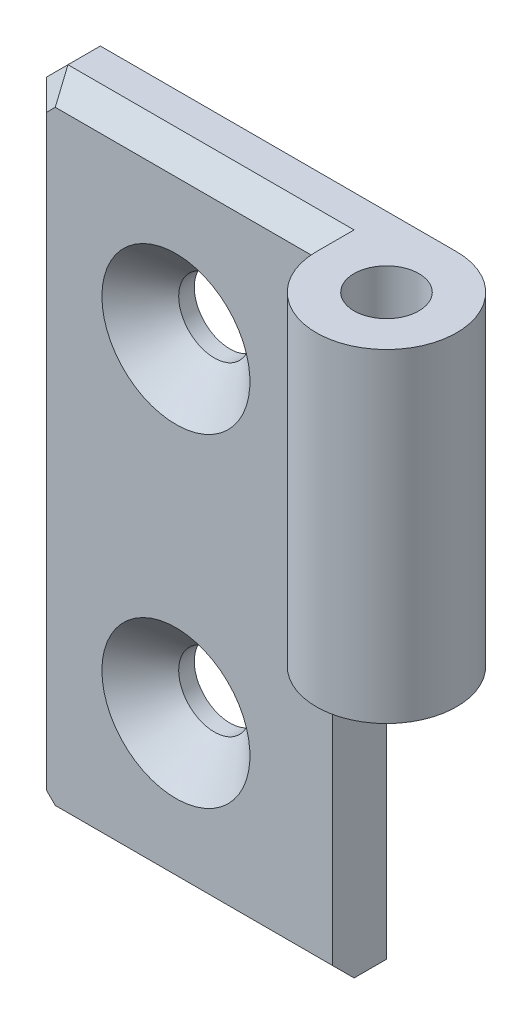
ISO-10303-21;
HEADER;
FILE_DESCRIPTION(('STEP AP214'),'2;1');
FILE_NAME('part.step','',(''),(''),'','','');
FILE_SCHEMA(('AUTOMOTIVE_DESIGN { 1 0 10303 214 1 1 1 1 }'));
ENDSEC;
DATA;
#1=APPLICATION_CONTEXT('core data for automotive mechanical design processes');
#2=APPLICATION_PROTOCOL_DEFINITION('international standard','automotive_design',2000,#1);
#3=PRODUCT_CONTEXT('',#1,'mechanical');
#4=PRODUCT('Part','Part','',(#3));
#5=PRODUCT_RELATED_PRODUCT_CATEGORY('part','',(#4));
#6=PRODUCT_DEFINITION_FORMATION('','',#4);
#7=PRODUCT_DEFINITION_CONTEXT('part definition',#1,'design');
#8=PRODUCT_DEFINITION('design','',#6,#7);
#9=PRODUCT_DEFINITION_SHAPE('','',#8);
#10=(LENGTH_UNIT() NAMED_UNIT(*) SI_UNIT(.MILLI.,.METRE.));
#11=(NAMED_UNIT(*) PLANE_ANGLE_UNIT() SI_UNIT($,.RADIAN.));
#12=(NAMED_UNIT(*) SI_UNIT($,.STERADIAN.) SOLID_ANGLE_UNIT());
#13=UNCERTAINTY_MEASURE_WITH_UNIT(LENGTH_MEASURE(1.E-05),#10,'distance_accuracy_value','');
#14=(GEOMETRIC_REPRESENTATION_CONTEXT(3) GLOBAL_UNCERTAINTY_ASSIGNED_CONTEXT((#13)) GLOBAL_UNIT_ASSIGNED_CONTEXT((#10,
#11,#12)) REPRESENTATION_CONTEXT('',''));
#15=CARTESIAN_POINT('',(0.,0.,0.));
#16=DIRECTION('',(0.,0.,1.));
#17=DIRECTION('',(1.,0.,0.));
#18=AXIS2_PLACEMENT_3D('',#15,#16,#17);
#19=CARTESIAN_POINT('',(-21.,-15.,5.));
#20=DIRECTION('',(0.,0.,1.));
#21=DIRECTION('',(-1.,0.,0.));
#22=AXIS2_PLACEMENT_3D('',#19,#20,#21);
#23=CONICAL_SURFACE('',#22,6.855,0.78539816339745);
#24=CARTESIAN_POINT('',(-21.,-15.,1.445));
#25=DIRECTION('',(0.,0.,1.));
#26=DIRECTION('',(-1.,0.,0.));
#27=AXIS2_PLACEMENT_3D('',#24,#25,#26);
#28=CIRCLE('',#27,3.3);
#29=CARTESIAN_POINT('',(-24.3,-15.,1.445));
#30=VERTEX_POINT('',#29);
#31=EDGE_CURVE('E28',#30,#30,#28,.T.);
#32=ORIENTED_EDGE('',*,*,#31,.F.);
#33=EDGE_LOOP('',(#32));
#34=FACE_BOUND('',#33,.T.);
#35=CARTESIAN_POINT('',(-21.,-15.,5.));
#36=DIRECTION('',(0.,0.,1.));
#37=DIRECTION('',(-1.,0.,0.));
#38=AXIS2_PLACEMENT_3D('',#35,#36,#37);
#39=CIRCLE('',#38,6.855);
#40=CARTESIAN_POINT('',(-27.855,-15.,5.));
#41=VERTEX_POINT('',#40);
#42=EDGE_CURVE('E11',#41,#41,#39,.T.);
#43=ORIENTED_EDGE('',*,*,#42,.T.);
#44=EDGE_LOOP('',(#43));
#45=FACE_BOUND('',#44,.T.);
#46=ADVANCED_FACE('F17',(#34,#45),#23,.F.);
#47=CARTESIAN_POINT('',(-21.,-15.,5.));
#48=DIRECTION('',(0.,0.,1.));
#49=DIRECTION('',(-1.,0.,0.));
#50=AXIS2_PLACEMENT_3D('',#47,#48,#49);
#51=CYLINDRICAL_SURFACE('',#50,3.3);
#52=CARTESIAN_POINT('',(-21.,-15.,0.));
#53=DIRECTION('',(0.,0.,1.));
#54=DIRECTION('',(-1.,0.,0.));
#55=AXIS2_PLACEMENT_3D('',#52,#53,#54);
#56=CIRCLE('',#55,3.3);
#57=CARTESIAN_POINT('',(-24.3,-15.,0.));
#58=VERTEX_POINT('',#57);
#59=EDGE_CURVE('E231',#58,#58,#56,.T.);
#60=ORIENTED_EDGE('',*,*,#59,.F.);
#61=EDGE_LOOP('',(#60));
#62=FACE_BOUND('',#61,.T.);
#63=ORIENTED_EDGE('',*,*,#31,.T.);
#64=EDGE_LOOP('',(#63));
#65=FACE_BOUND('',#64,.T.);
#66=ADVANCED_FACE('F19',(#62,#65),#51,.F.);
#67=CARTESIAN_POINT('',(-21.,15.,5.));
#68=DIRECTION('',(0.,0.,1.));
#69=DIRECTION('',(-1.,0.,0.));
#70=AXIS2_PLACEMENT_3D('',#67,#68,#69);
#71=CONICAL_SURFACE('',#70,6.855,0.78539816339745);
#72=CARTESIAN_POINT('',(-21.,15.,1.445));
#73=DIRECTION('',(0.,0.,1.));
#74=DIRECTION('',(-1.,0.,0.));
#75=AXIS2_PLACEMENT_3D('',#72,#73,#74);
#76=CIRCLE('',#75,3.3);
#77=CARTESIAN_POINT('',(-24.3,15.,1.445));
#78=VERTEX_POINT('',#77);
#79=EDGE_CURVE('E68',#78,#78,#76,.T.);
#80=ORIENTED_EDGE('',*,*,#79,.F.);
#81=EDGE_LOOP('',(#80));
#82=FACE_BOUND('',#81,.T.);
#83=CARTESIAN_POINT('',(-21.,15.,5.));
#84=DIRECTION('',(0.,0.,1.));
#85=DIRECTION('',(-1.,0.,0.));
#86=AXIS2_PLACEMENT_3D('',#83,#84,#85);
#87=CIRCLE('',#86,6.855);
#88=CARTESIAN_POINT('',(-27.855,15.,5.));
#89=VERTEX_POINT('',#88);
#90=EDGE_CURVE('E79',#89,#89,#87,.T.);
#91=ORIENTED_EDGE('',*,*,#90,.T.);
#92=EDGE_LOOP('',(#91));
#93=FACE_BOUND('',#92,.T.);
#94=ADVANCED_FACE('F457',(#82,#93),#71,.F.);
#95=CARTESIAN_POINT('',(-21.,15.,5.));
#96=DIRECTION('',(0.,0.,1.));
#97=DIRECTION('',(-1.,0.,0.));
#98=AXIS2_PLACEMENT_3D('',#95,#96,#97);
#99=CYLINDRICAL_SURFACE('',#98,3.3);
#100=CARTESIAN_POINT('',(-21.,15.,0.));
#101=DIRECTION('',(0.,0.,1.));
#102=DIRECTION('',(-1.,0.,0.));
#103=AXIS2_PLACEMENT_3D('',#100,#101,#102);
#104=CIRCLE('',#103,3.3);
#105=CARTESIAN_POINT('',(-24.3,15.,0.));
#106=VERTEX_POINT('',#105);
#107=EDGE_CURVE('E354',#106,#106,#104,.T.);
#108=ORIENTED_EDGE('',*,*,#107,.F.);
#109=EDGE_LOOP('',(#108));
#110=FACE_BOUND('',#109,.T.);
#111=ORIENTED_EDGE('',*,*,#79,.T.);
#112=EDGE_LOOP('',(#111));
#113=FACE_BOUND('',#112,.T.);
#114=ADVANCED_FACE('F452',(#110,#113),#99,.F.);
#115=CARTESIAN_POINT('',(0.,30.,6.5));
#116=DIRECTION('',(0.,-1.,0.));
#117=DIRECTION('',(0.,0.,1.));
#118=AXIS2_PLACEMENT_3D('',#115,#116,#117);
#119=CYLINDRICAL_SURFACE('',#118,3.);
#120=CARTESIAN_POINT('',(0.,30.,6.5));
#121=DIRECTION('',(0.,-1.,0.));
#122=DIRECTION('',(0.,0.,1.));
#123=AXIS2_PLACEMENT_3D('',#120,#121,#122);
#124=CIRCLE('',#123,3.);
#125=CARTESIAN_POINT('',(0.,30.,9.5));
#126=VERTEX_POINT('',#125);
#127=EDGE_CURVE('E258',#126,#126,#124,.T.);
#128=ORIENTED_EDGE('',*,*,#127,.F.);
#129=EDGE_LOOP('',(#128));
#130=FACE_BOUND('',#129,.T.);
#131=CARTESIAN_POINT('',(0.,0.,6.5));
#132=DIRECTION('',(0.,-1.,0.));
#133=DIRECTION('',(0.,0.,1.));
#134=AXIS2_PLACEMENT_3D('',#131,#132,#133);
#135=CIRCLE('',#134,3.);
#136=CARTESIAN_POINT('',(0.,0.,9.5));
#137=VERTEX_POINT('',#136);
#138=EDGE_CURVE('E226',#137,#137,#135,.T.);
#139=ORIENTED_EDGE('',*,*,#138,.T.);
#140=EDGE_LOOP('',(#139));
#141=FACE_BOUND('',#140,.T.);
#142=ADVANCED_FACE('F415',(#130,#141),#119,.F.);
#143=CARTESIAN_POINT('',(0.,30.,6.5));
#144=DIRECTION('',(0.,-1.,0.));
#145=DIRECTION('',(0.,0.,1.));
#146=AXIS2_PLACEMENT_3D('',#143,#144,#145);
#147=CYLINDRICAL_SURFACE('',#146,6.5);
#148=CARTESIAN_POINT('',(0.,30.,6.5));
#149=DIRECTION('',(0.,-1.,0.));
#150=DIRECTION('',(0.,0.,1.));
#151=AXIS2_PLACEMENT_3D('',#148,#149,#150);
#152=CIRCLE('',#151,6.5);
#153=CARTESIAN_POINT('',(0.,30.,0.));
#154=VERTEX_POINT('',#153);
#155=CARTESIAN_POINT('',(-6.5,30.,6.5));
#156=VERTEX_POINT('',#155);
#157=EDGE_CURVE('E266',#154,#156,#152,.T.);
#158=ORIENTED_EDGE('',*,*,#157,.T.);
#159=DIRECTION('',(0.,-1.,0.));
#160=VECTOR('',#159,1.);
#161=CARTESIAN_POINT('',(-6.5,30.,6.5));
#162=LINE('',#161,#160);
#163=CARTESIAN_POINT('',(-6.5,0.,6.5));
#164=VERTEX_POINT('',#163);
#165=EDGE_CURVE('E239',#156,#164,#162,.T.);
#166=ORIENTED_EDGE('',*,*,#165,.T.);
#167=CARTESIAN_POINT('',(0.,0.,6.5));
#168=DIRECTION('',(0.,-1.,0.));
#169=DIRECTION('',(0.,0.,1.));
#170=AXIS2_PLACEMENT_3D('',#167,#168,#169);
#171=CIRCLE('',#170,6.5);
#172=CARTESIAN_POINT('',(0.,0.,0.));
#173=VERTEX_POINT('',#172);
#174=EDGE_CURVE('E275',#173,#164,#171,.T.);
#175=ORIENTED_EDGE('',*,*,#174,.F.);
#176=DIRECTION('',(0.,-1.,0.));
#177=VECTOR('',#176,1.);
#178=CARTESIAN_POINT('',(0.,30.,0.));
#179=LINE('',#178,#177);
#180=EDGE_CURVE('E227',#154,#173,#179,.T.);
#181=ORIENTED_EDGE('',*,*,#180,.F.);
#182=EDGE_LOOP('',(#158,#166,#175,#181));
#183=FACE_BOUND('',#182,.T.);
#184=ADVANCED_FACE('F409',(#183),#147,.T.);
#185=CARTESIAN_POINT('',(-6.5,-30.,5.));
#186=DIRECTION('',(-1.,0.,0.));
#187=DIRECTION('',(0.,-1.,0.));
#188=AXIS2_PLACEMENT_3D('',#185,#186,#187);
#189=PLANE('',#188);
#190=DIRECTION('',(0.,1.,0.));
#191=VECTOR('',#190,1.);
#192=CARTESIAN_POINT('',(-6.5,-30.,5.));
#193=LINE('',#192,#191);
#194=CARTESIAN_POINT('',(-6.5,-28.,5.));
#195=VERTEX_POINT('',#194);
#196=CARTESIAN_POINT('',(-6.5,0.,5.));
#197=VERTEX_POINT('',#196);
#198=EDGE_CURVE('E230',#195,#197,#193,.T.);
#199=ORIENTED_EDGE('',*,*,#198,.F.);
#200=DIRECTION('',(0.,-0.707106781186546,-0.707106781186549));
#201=VECTOR('',#200,1.);
#202=CARTESIAN_POINT('',(-6.5,-28.,5.));
#203=LINE('',#202,#201);
#204=CARTESIAN_POINT('',(-6.5,-30.,3.));
#205=VERTEX_POINT('',#204);
#206=EDGE_CURVE('E235',#195,#205,#203,.T.);
#207=ORIENTED_EDGE('',*,*,#206,.T.);
#208=DIRECTION('',(0.,0.,-1.));
#209=VECTOR('',#208,1.);
#210=CARTESIAN_POINT('',(-6.5,-30.,5.));
#211=LINE('',#210,#209);
#212=CARTESIAN_POINT('',(-6.5,-30.,0.));
#213=VERTEX_POINT('',#212);
#214=EDGE_CURVE('E240',#205,#213,#211,.T.);
#215=ORIENTED_EDGE('',*,*,#214,.T.);
#216=DIRECTION('',(0.,1.,0.));
#217=VECTOR('',#216,1.);
#218=CARTESIAN_POINT('',(-6.5,-30.,0.));
#219=LINE('',#218,#217);
#220=CARTESIAN_POINT('',(-6.5,0.,0.));
#221=VERTEX_POINT('',#220);
#222=EDGE_CURVE('E253',#213,#221,#219,.T.);
#223=ORIENTED_EDGE('',*,*,#222,.T.);
#224=DIRECTION('',(0.,0.,-1.));
#225=VECTOR('',#224,1.);
#226=CARTESIAN_POINT('',(-6.5,0.,6.5));
#227=LINE('',#226,#225);
#228=EDGE_CURVE('E244',#197,#221,#227,.T.);
#229=ORIENTED_EDGE('',*,*,#228,.F.);
#230=EDGE_LOOP('',(#199,#207,#215,#223,#229));
#231=FACE_BOUND('',#230,.T.);
#232=ADVANCED_FACE('F414',(#231),#189,.F.);
#233=CARTESIAN_POINT('',(-6.5,30.,5.));
#234=DIRECTION('',(0.,-1.,0.));
#235=DIRECTION('',(-1.,0.,0.));
#236=AXIS2_PLACEMENT_3D('',#233,#234,#235);
#237=PLANE('',#236);
#238=DIRECTION('',(0.,0.,-1.));
#239=VECTOR('',#238,1.);
#240=CARTESIAN_POINT('',(-33.,30.,5.));
#241=LINE('',#240,#239);
#242=CARTESIAN_POINT('',(-33.,30.,3.));
#243=VERTEX_POINT('',#242);
#244=CARTESIAN_POINT('',(-33.,30.,0.));
#245=VERTEX_POINT('',#244);
#246=EDGE_CURVE('E259',#243,#245,#241,.T.);
#247=ORIENTED_EDGE('',*,*,#246,.F.);
#248=DIRECTION('',(1.,0.,0.));
#249=VECTOR('',#248,1.);
#250=CARTESIAN_POINT('',(-6.5,30.,3.));
#251=LINE('',#250,#249);
#252=CARTESIAN_POINT('',(-6.5,30.,3.));
#253=VERTEX_POINT('',#252);
#254=EDGE_CURVE('E21',#243,#253,#251,.T.);
#255=ORIENTED_EDGE('',*,*,#254,.T.);
#256=DIRECTION('',(0.,0.,-1.));
#257=VECTOR('',#256,1.);
#258=CARTESIAN_POINT('',(-6.5,30.,6.5));
#259=LINE('',#258,#257);
#260=EDGE_CURVE('E264',#156,#253,#259,.T.);
#261=ORIENTED_EDGE('',*,*,#260,.F.);
#262=ORIENTED_EDGE('',*,*,#157,.F.);
#263=DIRECTION('',(-1.,0.,0.));
#264=VECTOR('',#263,1.);
#265=CARTESIAN_POINT('',(-6.5,30.,0.));
#266=LINE('',#265,#264);
#267=EDGE_CURVE('E295',#154,#245,#266,.T.);
#268=ORIENTED_EDGE('',*,*,#267,.T.);
#269=EDGE_LOOP('',(#247,#255,#261,#262,#268));
#270=FACE_BOUND('',#269,.T.);
#271=ORIENTED_EDGE('',*,*,#127,.T.);
#272=EDGE_LOOP('',(#271));
#273=FACE_BOUND('',#272,.T.);
#274=ADVANCED_FACE('F327',(#270,#273),#237,.F.);
#275=CARTESIAN_POINT('',(-33.,30.,5.));
#276=DIRECTION('',(0.707106781186549,-0.707106781186546,0.));
#277=DIRECTION('',(0.,0.,1.));
#278=AXIS2_PLACEMENT_3D('',#275,#276,#277);
#279=PLANE('',#278);
#280=DIRECTION('',(0.,0.,-1.));
#281=VECTOR('',#280,1.);
#282=CARTESIAN_POINT('',(-35.,28.,5.));
#283=LINE('',#282,#281);
#284=CARTESIAN_POINT('',(-35.,28.,3.));
#285=VERTEX_POINT('',#284);
#286=CARTESIAN_POINT('',(-35.,28.,0.));
#287=VERTEX_POINT('',#286);
#288=EDGE_CURVE('E203',#285,#287,#283,.T.);
#289=ORIENTED_EDGE('',*,*,#288,.F.);
#290=DIRECTION('',(0.707106781186546,0.707106781186549,0.));
#291=VECTOR('',#290,1.);
#292=CARTESIAN_POINT('',(-33.,30.,3.));
#293=LINE('',#292,#291);
#294=EDGE_CURVE('E254',#285,#243,#293,.T.);
#295=ORIENTED_EDGE('',*,*,#294,.T.);
#296=ORIENTED_EDGE('',*,*,#246,.T.);
#297=DIRECTION('',(-0.707106781186546,-0.707106781186549,0.));
#298=VECTOR('',#297,1.);
#299=CARTESIAN_POINT('',(-33.,30.,0.));
#300=LINE('',#299,#298);
#301=EDGE_CURVE('E202',#245,#287,#300,.T.);
#302=ORIENTED_EDGE('',*,*,#301,.T.);
#303=EDGE_LOOP('',(#289,#295,#296,#302));
#304=FACE_BOUND('',#303,.T.);
#305=ADVANCED_FACE('F334',(#304),#279,.F.);
#306=CARTESIAN_POINT('',(-35.,-28.,5.));
#307=DIRECTION('',(1.,0.,0.));
#308=DIRECTION('',(0.,-1.,0.));
#309=AXIS2_PLACEMENT_3D('',#306,#307,#308);
#310=PLANE('',#309);
#311=DIRECTION('',(0.,0.,-1.));
#312=VECTOR('',#311,1.);
#313=CARTESIAN_POINT('',(-35.,-28.,5.));
#314=LINE('',#313,#312);
#315=CARTESIAN_POINT('',(-35.,-28.,3.));
#316=VERTEX_POINT('',#315);
#317=CARTESIAN_POINT('',(-35.,-28.,0.));
#318=VERTEX_POINT('',#317);
#319=EDGE_CURVE('E169',#316,#318,#314,.T.);
#320=ORIENTED_EDGE('',*,*,#319,.F.);
#321=DIRECTION('',(0.,1.,0.));
#322=VECTOR('',#321,1.);
#323=CARTESIAN_POINT('',(-35.,28.,3.));
#324=LINE('',#323,#322);
#325=EDGE_CURVE('E173',#316,#285,#324,.T.);
#326=ORIENTED_EDGE('',*,*,#325,.T.);
#327=ORIENTED_EDGE('',*,*,#288,.T.);
#328=DIRECTION('',(0.,-1.,0.));
#329=VECTOR('',#328,1.);
#330=CARTESIAN_POINT('',(-35.,-28.,0.));
#331=LINE('',#330,#329);
#332=EDGE_CURVE('E176',#287,#318,#331,.T.);
#333=ORIENTED_EDGE('',*,*,#332,.T.);
#334=EDGE_LOOP('',(#320,#326,#327,#333));
#335=FACE_BOUND('',#334,.T.);
#336=ADVANCED_FACE('F171',(#335),#310,.F.);
#337=CARTESIAN_POINT('',(-33.,-30.,5.));
#338=DIRECTION('',(0.70710678118655,0.707106781186545,0.));
#339=DIRECTION('',(0.707106781186545,-0.70710678118655,0.));
#340=AXIS2_PLACEMENT_3D('',#337,#338,#339);
#341=PLANE('',#340);
#342=DIRECTION('',(0.,0.,-1.));
#343=VECTOR('',#342,1.);
#344=CARTESIAN_POINT('',(-33.,-30.,5.));
#345=LINE('',#344,#343);
#346=CARTESIAN_POINT('',(-33.,-30.,3.));
#347=VERTEX_POINT('',#346);
#348=CARTESIAN_POINT('',(-33.,-30.,0.));
#349=VERTEX_POINT('',#348);
#350=EDGE_CURVE('E186',#347,#349,#345,.T.);
#351=ORIENTED_EDGE('',*,*,#350,.F.);
#352=DIRECTION('',(-0.707106781186545,0.70710678118655,0.));
#353=VECTOR('',#352,1.);
#354=CARTESIAN_POINT('',(-35.,-28.,3.));
#355=LINE('',#354,#353);
#356=EDGE_CURVE('E181',#347,#316,#355,.T.);
#357=ORIENTED_EDGE('',*,*,#356,.T.);
#358=ORIENTED_EDGE('',*,*,#319,.T.);
#359=DIRECTION('',(0.707106781186545,-0.70710678118655,0.));
#360=VECTOR('',#359,1.);
#361=CARTESIAN_POINT('',(-33.,-30.,0.));
#362=LINE('',#361,#360);
#363=EDGE_CURVE('E182',#318,#349,#362,.T.);
#364=ORIENTED_EDGE('',*,*,#363,.T.);
#365=EDGE_LOOP('',(#351,#357,#358,#364));
#366=FACE_BOUND('',#365,.T.);
#367=ADVANCED_FACE('F185',(#366),#341,.F.);
#368=CARTESIAN_POINT('',(-6.5,-30.,5.));
#369=DIRECTION('',(0.,1.,0.));
#370=DIRECTION('',(0.,0.,-1.));
#371=AXIS2_PLACEMENT_3D('',#368,#369,#370);
#372=PLANE('',#371);
#373=ORIENTED_EDGE('',*,*,#214,.F.);
#374=DIRECTION('',(-1.,0.,0.));
#375=VECTOR('',#374,1.);
#376=CARTESIAN_POINT('',(-33.,-30.,3.));
#377=LINE('',#376,#375);
#378=EDGE_CURVE('E346',#205,#347,#377,.T.);
#379=ORIENTED_EDGE('',*,*,#378,.T.);
#380=ORIENTED_EDGE('',*,*,#350,.T.);
#381=DIRECTION('',(1.,0.,0.));
#382=VECTOR('',#381,1.);
#383=CARTESIAN_POINT('',(-6.5,-30.,0.));
#384=LINE('',#383,#382);
#385=EDGE_CURVE('E286',#349,#213,#384,.T.);
#386=ORIENTED_EDGE('',*,*,#385,.T.);
#387=EDGE_LOOP('',(#373,#379,#380,#386));
#388=FACE_BOUND('',#387,.T.);
#389=ADVANCED_FACE('F383',(#388),#372,.F.);
#390=CARTESIAN_POINT('',(-6.5,30.,5.));
#391=DIRECTION('',(0.,0.,1.));
#392=DIRECTION('',(-1.,0.,0.));
#393=AXIS2_PLACEMENT_3D('',#390,#391,#392);
#394=PLANE('',#393);
#395=DIRECTION('',(0.,-1.,0.));
#396=VECTOR('',#395,1.);
#397=CARTESIAN_POINT('',(-6.5,30.,5.));
#398=LINE('',#397,#396);
#399=CARTESIAN_POINT('',(-6.5,28.,5.));
#400=VERTEX_POINT('',#399);
#401=EDGE_CURVE('E265',#400,#197,#398,.T.);
#402=ORIENTED_EDGE('',*,*,#401,.F.);
#403=DIRECTION('',(-1.,0.,0.));
#404=VECTOR('',#403,1.);
#405=CARTESIAN_POINT('',(-33.,28.,5.));
#406=LINE('',#405,#404);
#407=CARTESIAN_POINT('',(-32.1715728752539,28.,5.));
#408=VERTEX_POINT('',#407);
#409=EDGE_CURVE('E282',#400,#408,#406,.T.);
#410=ORIENTED_EDGE('',*,*,#409,.T.);
#411=DIRECTION('',(-0.707106781186546,-0.707106781186549,0.));
#412=VECTOR('',#411,1.);
#413=CARTESIAN_POINT('',(-33.5857864376269,26.5857864376269,5.));
#414=LINE('',#413,#412);
#415=CARTESIAN_POINT('',(-33.,27.1715728752538,5.));
#416=VERTEX_POINT('',#415);
#417=EDGE_CURVE('E287',#408,#416,#414,.T.);
#418=ORIENTED_EDGE('',*,*,#417,.T.);
#419=DIRECTION('',(0.,-1.,0.));
#420=VECTOR('',#419,1.);
#421=CARTESIAN_POINT('',(-33.,-28.,5.));
#422=LINE('',#421,#420);
#423=CARTESIAN_POINT('',(-33.,-27.1715728752538,5.));
#424=VERTEX_POINT('',#423);
#425=EDGE_CURVE('E291',#416,#424,#422,.T.);
#426=ORIENTED_EDGE('',*,*,#425,.T.);
#427=DIRECTION('',(0.707106781186545,-0.70710678118655,0.));
#428=VECTOR('',#427,1.);
#429=CARTESIAN_POINT('',(-31.585786437627,-28.5857864376269,5.));
#430=LINE('',#429,#428);
#431=CARTESIAN_POINT('',(-32.1715728752539,-28.,5.));
#432=VERTEX_POINT('',#431);
#433=EDGE_CURVE('E207',#424,#432,#430,.T.);
#434=ORIENTED_EDGE('',*,*,#433,.T.);
#435=DIRECTION('',(1.,0.,0.));
#436=VECTOR('',#435,1.);
#437=CARTESIAN_POINT('',(-6.5,-28.,5.));
#438=LINE('',#437,#436);
#439=EDGE_CURVE('E296',#432,#195,#438,.T.);
#440=ORIENTED_EDGE('',*,*,#439,.T.);
#441=ORIENTED_EDGE('',*,*,#198,.T.);
#442=EDGE_LOOP('',(#402,#410,#418,#426,#434,#440,#441));
#443=FACE_BOUND('',#442,.T.);
#444=ORIENTED_EDGE('',*,*,#42,.F.);
#445=EDGE_LOOP('',(#444));
#446=FACE_BOUND('',#445,.T.);
#447=ORIENTED_EDGE('',*,*,#90,.F.);
#448=EDGE_LOOP('',(#447));
#449=FACE_BOUND('',#448,.T.);
#450=ADVANCED_FACE('F388',(#443,#446,#449),#394,.T.);
#451=CARTESIAN_POINT('',(-6.5,30.,0.));
#452=DIRECTION('',(0.,0.,1.));
#453=DIRECTION('',(-1.,0.,0.));
#454=AXIS2_PLACEMENT_3D('',#451,#452,#453);
#455=PLANE('',#454);
#456=ORIENTED_EDGE('',*,*,#222,.F.);
#457=ORIENTED_EDGE('',*,*,#385,.F.);
#458=ORIENTED_EDGE('',*,*,#363,.F.);
#459=ORIENTED_EDGE('',*,*,#332,.F.);
#460=ORIENTED_EDGE('',*,*,#301,.F.);
#461=ORIENTED_EDGE('',*,*,#267,.F.);
#462=ORIENTED_EDGE('',*,*,#180,.T.);
#463=DIRECTION('',(1.,0.,0.));
#464=VECTOR('',#463,1.);
#465=CARTESIAN_POINT('',(0.,0.,0.));
#466=LINE('',#465,#464);
#467=EDGE_CURVE('E217',#221,#173,#466,.T.);
#468=ORIENTED_EDGE('',*,*,#467,.F.);
#469=EDGE_LOOP('',(#456,#457,#458,#459,#460,#461,#462,#468));
#470=FACE_BOUND('',#469,.T.);
#471=ORIENTED_EDGE('',*,*,#59,.T.);
#472=EDGE_LOOP('',(#471));
#473=FACE_BOUND('',#472,.T.);
#474=ORIENTED_EDGE('',*,*,#107,.T.);
#475=EDGE_LOOP('',(#474));
#476=FACE_BOUND('',#475,.T.);
#477=ADVANCED_FACE('F336',(#470,#473,#476),#455,.F.);
#478=CARTESIAN_POINT('',(-6.5,30.,6.5));
#479=DIRECTION('',(-1.,0.,0.));
#480=DIRECTION('',(0.,-1.,0.));
#481=AXIS2_PLACEMENT_3D('',#478,#479,#480);
#482=PLANE('',#481);
#483=ORIENTED_EDGE('',*,*,#260,.T.);
#484=DIRECTION('',(0.,-0.707106781186546,0.707106781186549));
#485=VECTOR('',#484,1.);
#486=CARTESIAN_POINT('',(-6.5,28.,5.));
#487=LINE('',#486,#485);
#488=EDGE_CURVE('E260',#253,#400,#487,.T.);
#489=ORIENTED_EDGE('',*,*,#488,.T.);
#490=ORIENTED_EDGE('',*,*,#401,.T.);
#491=DIRECTION('',(0.,0.,-1.));
#492=VECTOR('',#491,1.);
#493=CARTESIAN_POINT('',(-6.5,0.,6.5));
#494=LINE('',#493,#492);
#495=EDGE_CURVE('E249',#164,#197,#494,.T.);
#496=ORIENTED_EDGE('',*,*,#495,.F.);
#497=ORIENTED_EDGE('',*,*,#165,.F.);
#498=EDGE_LOOP('',(#483,#489,#490,#496,#497));
#499=FACE_BOUND('',#498,.T.);
#500=ADVANCED_FACE('F442',(#499),#482,.T.);
#501=CARTESIAN_POINT('',(0.,0.,6.5));
#502=DIRECTION('',(0.,-1.,0.));
#503=DIRECTION('',(-1.,0.,0.));
#504=AXIS2_PLACEMENT_3D('',#501,#502,#503);
#505=PLANE('',#504);
#506=ORIENTED_EDGE('',*,*,#174,.T.);
#507=ORIENTED_EDGE('',*,*,#495,.T.);
#508=ORIENTED_EDGE('',*,*,#228,.T.);
#509=ORIENTED_EDGE('',*,*,#467,.T.);
#510=EDGE_LOOP('',(#506,#507,#508,#509));
#511=FACE_BOUND('',#510,.T.);
#512=ORIENTED_EDGE('',*,*,#138,.F.);
#513=EDGE_LOOP('',(#512));
#514=FACE_BOUND('',#513,.T.);
#515=ADVANCED_FACE('F436',(#511,#514),#505,.T.);
#516=CARTESIAN_POINT('',(-6.5,-28.,5.));
#517=DIRECTION('',(0.,-0.707106781186549,0.707106781186546));
#518=DIRECTION('',(-1.,0.,0.));
#519=AXIS2_PLACEMENT_3D('',#516,#517,#518);
#520=PLANE('',#519);
#521=ORIENTED_EDGE('',*,*,#206,.F.);
#522=ORIENTED_EDGE('',*,*,#439,.F.);
#523=DIRECTION('',(0.28108463771482,0.678598344545846,0.678598344545848));
#524=VECTOR('',#523,1.);
#525=CARTESIAN_POINT('',(-30.1432985213571,-23.1033125466091,9.89668745339093));
#526=LINE('',#525,#524);
#527=EDGE_CURVE('E210',#347,#432,#526,.T.);
#528=ORIENTED_EDGE('',*,*,#527,.F.);
#529=ORIENTED_EDGE('',*,*,#378,.F.);
#530=EDGE_LOOP('',(#521,#522,#528,#529));
#531=FACE_BOUND('',#530,.T.);
#532=ADVANCED_FACE('F441',(#531),#520,.T.);
#533=CARTESIAN_POINT('',(-48.335786437627,-11.8357864376267,5.));
#534=DIRECTION('',(-0.5,-0.5,0.707106781186546));
#535=DIRECTION('',(-0.707106781186545,0.70710678118655,0.));
#536=AXIS2_PLACEMENT_3D('',#533,#534,#535);
#537=PLANE('',#536);
#538=ORIENTED_EDGE('',*,*,#527,.T.);
#539=ORIENTED_EDGE('',*,*,#433,.F.);
#540=DIRECTION('',(0.678598344545847,0.281084637714817,0.678598344545849));
#541=VECTOR('',#540,1.);
#542=CARTESIAN_POINT('',(-37.1368612621184,-28.8851169156791,0.863138737881594));
#543=LINE('',#542,#541);
#544=EDGE_CURVE('E198',#316,#424,#543,.T.);
#545=ORIENTED_EDGE('',*,*,#544,.F.);
#546=ORIENTED_EDGE('',*,*,#356,.F.);
#547=EDGE_LOOP('',(#538,#539,#545,#546));
#548=FACE_BOUND('',#547,.T.);
#549=ADVANCED_FACE('F205',(#548),#537,.T.);
#550=CARTESIAN_POINT('',(-33.,30.,5.));
#551=DIRECTION('',(-0.707106781186549,0.,0.707106781186546));
#552=DIRECTION('',(0.,1.,0.));
#553=AXIS2_PLACEMENT_3D('',#550,#551,#552);
#554=PLANE('',#553);
#555=ORIENTED_EDGE('',*,*,#544,.T.);
#556=ORIENTED_EDGE('',*,*,#425,.F.);
#557=DIRECTION('',(0.678598344545846,-0.28108463771482,0.678598344545848));
#558=VECTOR('',#557,1.);
#559=CARTESIAN_POINT('',(-33.5395042867797,27.3950428677963,4.46049571322036));
#560=LINE('',#559,#558);
#561=EDGE_CURVE('E200',#285,#416,#560,.T.);
#562=ORIENTED_EDGE('',*,*,#561,.F.);
#563=ORIENTED_EDGE('',*,*,#325,.F.);
#564=EDGE_LOOP('',(#555,#556,#562,#563));
#565=FACE_BOUND('',#564,.T.);
#566=ADVANCED_FACE('F197',(#565),#554,.T.);
#567=CARTESIAN_POINT('',(-18.335786437627,41.8357864376269,5.));
#568=DIRECTION('',(-0.5,0.5,0.707106781186547));
#569=DIRECTION('',(0.707106781186546,0.707106781186549,0.));
#570=AXIS2_PLACEMENT_3D('',#567,#568,#569);
#571=PLANE('',#570);
#572=ORIENTED_EDGE('',*,*,#561,.T.);
#573=ORIENTED_EDGE('',*,*,#417,.F.);
#574=DIRECTION('',(0.281084637714822,-0.678598344545846,0.678598344545848));
#575=VECTOR('',#574,1.);
#576=CARTESIAN_POINT('',(-33.7175144212722,31.7322330470336,1.26776695296638));
#577=LINE('',#576,#575);
#578=EDGE_CURVE('E220',#243,#408,#577,.T.);
#579=ORIENTED_EDGE('',*,*,#578,.F.);
#580=ORIENTED_EDGE('',*,*,#294,.F.);
#581=EDGE_LOOP('',(#572,#573,#579,#580));
#582=FACE_BOUND('',#581,.T.);
#583=ADVANCED_FACE('F321',(#582),#571,.T.);
#584=CARTESIAN_POINT('',(-6.5,28.,5.));
#585=DIRECTION('',(0.,0.707106781186549,0.707106781186546));
#586=DIRECTION('',(1.,0.,0.));
#587=AXIS2_PLACEMENT_3D('',#584,#585,#586);
#588=PLANE('',#587);
#589=ORIENTED_EDGE('',*,*,#488,.F.);
#590=ORIENTED_EDGE('',*,*,#254,.F.);
#591=ORIENTED_EDGE('',*,*,#578,.T.);
#592=ORIENTED_EDGE('',*,*,#409,.F.);
#593=EDGE_LOOP('',(#589,#590,#591,#592));
#594=FACE_BOUND('',#593,.T.);
#595=ADVANCED_FACE('F318',(#594),#588,.T.);
#596=CLOSED_SHELL('',(#46,#66,#94,#114,#142,#184,#232,#274,#305,#336,#367,#389,#450,#477,#500,
#515,#532,#549,#566,#583,#595));
#597=MANIFOLD_SOLID_BREP('B1',#596);
#598=ADVANCED_BREP_SHAPE_REPRESENTATION('',(#18,#597),#14);
#599=SHAPE_DEFINITION_REPRESENTATION(#9,#598);
ENDSEC;
END-ISO-10303-21;
